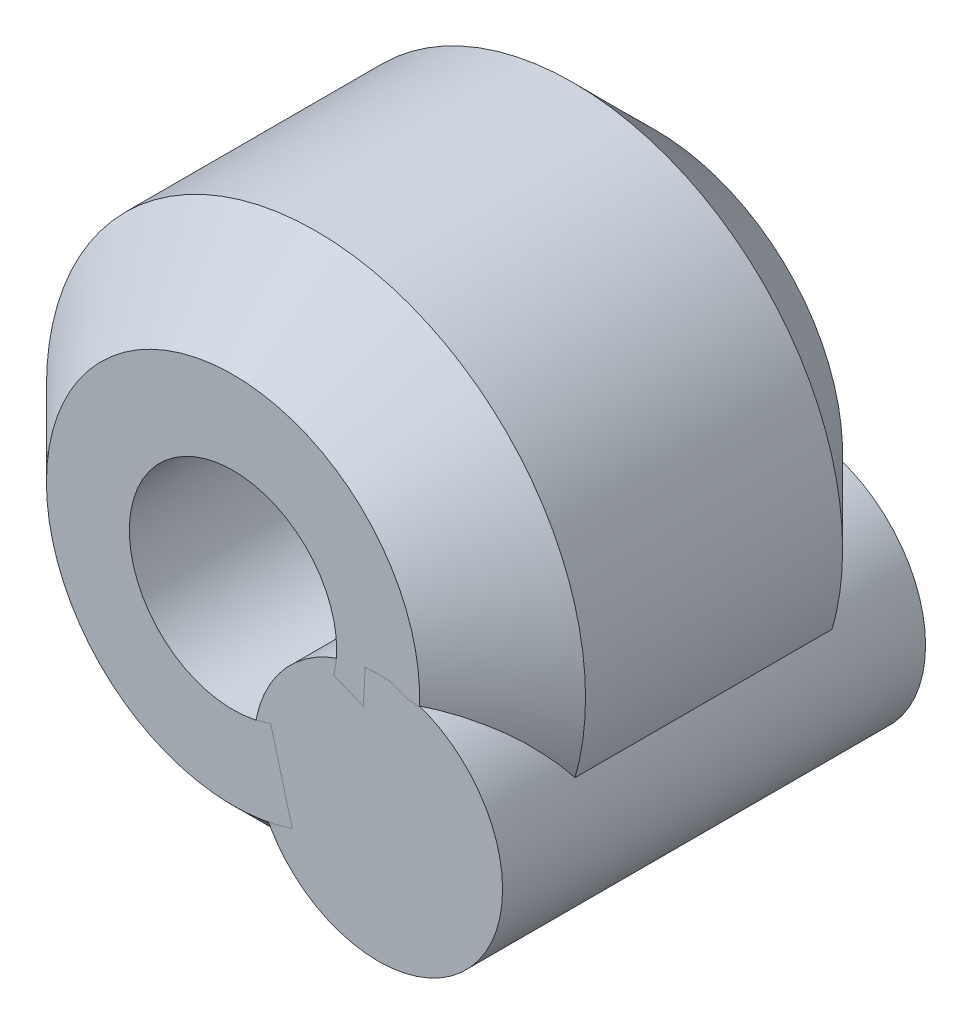
ISO-10303-21;
HEADER;
FILE_DESCRIPTION(('STEP AP214'),'2;1');
FILE_NAME('part.step','',(''),(''),'','','');
FILE_SCHEMA(('AUTOMOTIVE_DESIGN { 1 0 10303 214 1 1 1 1 }'));
ENDSEC;
DATA;
#1=APPLICATION_CONTEXT('core data for automotive mechanical design processes');
#2=APPLICATION_PROTOCOL_DEFINITION('international standard','automotive_design',2000,#1);
#3=PRODUCT_CONTEXT('',#1,'mechanical');
#4=PRODUCT('Part','Part','',(#3));
#5=PRODUCT_RELATED_PRODUCT_CATEGORY('part','',(#4));
#6=PRODUCT_DEFINITION_FORMATION('','',#4);
#7=PRODUCT_DEFINITION_CONTEXT('part definition',#1,'design');
#8=PRODUCT_DEFINITION('design','',#6,#7);
#9=PRODUCT_DEFINITION_SHAPE('','',#8);
#10=(LENGTH_UNIT() NAMED_UNIT(*) SI_UNIT(.MILLI.,.METRE.));
#11=(NAMED_UNIT(*) PLANE_ANGLE_UNIT() SI_UNIT($,.RADIAN.));
#12=(NAMED_UNIT(*) SI_UNIT($,.STERADIAN.) SOLID_ANGLE_UNIT());
#13=UNCERTAINTY_MEASURE_WITH_UNIT(LENGTH_MEASURE(1.E-05),#10,'distance_accuracy_value','');
#14=(GEOMETRIC_REPRESENTATION_CONTEXT(3) GLOBAL_UNCERTAINTY_ASSIGNED_CONTEXT((#13)) GLOBAL_UNIT_ASSIGNED_CONTEXT((#10,
#11,#12)) REPRESENTATION_CONTEXT('',''));
#15=CARTESIAN_POINT('',(0.,0.,0.));
#16=DIRECTION('',(0.,0.,1.));
#17=DIRECTION('',(1.,0.,0.));
#18=AXIS2_PLACEMENT_3D('',#15,#16,#17);
#19=CARTESIAN_POINT('',(-14.5,0.,-5.1));
#20=DIRECTION('',(0.,0.,-1.));
#21=DIRECTION('',(-1.,0.,0.));
#22=AXIS2_PLACEMENT_3D('',#19,#20,#21);
#23=CYLINDRICAL_SURFACE('',#22,6.5);
#24=CARTESIAN_POINT('',(-14.5,0.,-3.1));
#25=DIRECTION('',(0.,0.,-1.));
#26=DIRECTION('',(-1.,0.,0.));
#27=AXIS2_PLACEMENT_3D('',#24,#25,#26);
#28=CIRCLE('',#27,6.5);
#29=CARTESIAN_POINT('',(-21.,0.,-3.1));
#30=VERTEX_POINT('',#29);
#31=EDGE_CURVE('E11',#30,#30,#28,.T.);
#32=ORIENTED_EDGE('',*,*,#31,.F.);
#33=EDGE_LOOP('',(#32));
#34=FACE_BOUND('',#33,.T.);
#35=CARTESIAN_POINT('',(-14.5,0.,3.1));
#36=DIRECTION('',(0.,0.,-1.));
#37=DIRECTION('',(-1.,0.,0.));
#38=AXIS2_PLACEMENT_3D('',#35,#36,#37);
#39=CIRCLE('',#38,6.5);
#40=CARTESIAN_POINT('',(-21.,0.,3.1));
#41=VERTEX_POINT('',#40);
#42=EDGE_CURVE('E58',#41,#41,#39,.T.);
#43=ORIENTED_EDGE('',*,*,#42,.T.);
#44=EDGE_LOOP('',(#43));
#45=FACE_BOUND('',#44,.T.);
#46=ADVANCED_FACE('F44',(#34,#45),#23,.T.);
#47=CARTESIAN_POINT('',(-14.5,0.,-3.1));
#48=DIRECTION('',(0.,0.,1.));
#49=DIRECTION('',(1.,0.,0.));
#50=AXIS2_PLACEMENT_3D('',#47,#48,#49);
#51=CONICAL_SURFACE('',#50,6.5,0.785398163397447);
#52=CARTESIAN_POINT('',(-14.5,0.,-5.1));
#53=DIRECTION('',(0.,0.,-1.));
#54=DIRECTION('',(-1.,0.,0.));
#55=AXIS2_PLACEMENT_3D('',#52,#53,#54);
#56=CIRCLE('',#55,4.5);
#57=CARTESIAN_POINT('',(-19.,0.,-5.1));
#58=VERTEX_POINT('',#57);
#59=EDGE_CURVE('E50',#58,#58,#56,.T.);
#60=ORIENTED_EDGE('',*,*,#59,.F.);
#61=EDGE_LOOP('',(#60));
#62=FACE_BOUND('',#61,.T.);
#63=ORIENTED_EDGE('',*,*,#31,.T.);
#64=EDGE_LOOP('',(#63));
#65=FACE_BOUND('',#64,.T.);
#66=ADVANCED_FACE('F90',(#62,#65),#51,.T.);
#67=CARTESIAN_POINT('',(-10.,0.,-5.1));
#68=DIRECTION('',(0.,0.,1.));
#69=DIRECTION('',(1.,0.,0.));
#70=AXIS2_PLACEMENT_3D('',#67,#68,#69);
#71=PLANE('',#70);
#72=CARTESIAN_POINT('',(-14.5,0.,-5.1));
#73=DIRECTION('',(0.,0.,1.));
#74=DIRECTION('',(1.,0.,0.));
#75=AXIS2_PLACEMENT_3D('',#72,#73,#74);
#76=CIRCLE('',#75,2.5);
#77=CARTESIAN_POINT('',(-12.,0.,-5.1));
#78=VERTEX_POINT('',#77);
#79=EDGE_CURVE('E63',#78,#78,#76,.T.);
#80=ORIENTED_EDGE('',*,*,#79,.T.);
#81=EDGE_LOOP('',(#80));
#82=FACE_BOUND('',#81,.T.);
#83=ORIENTED_EDGE('',*,*,#59,.T.);
#84=EDGE_LOOP('',(#83));
#85=FACE_BOUND('',#84,.T.);
#86=ADVANCED_FACE('F76',(#82,#85),#71,.F.);
#87=CARTESIAN_POINT('',(-14.5,0.,5.10000000000001));
#88=DIRECTION('',(0.,0.,-1.));
#89=DIRECTION('',(-1.,0.,0.));
#90=AXIS2_PLACEMENT_3D('',#87,#88,#89);
#91=PLANE('',#90);
#92=CARTESIAN_POINT('',(-14.5,0.,5.10000000000001));
#93=DIRECTION('',(0.,0.,1.));
#94=DIRECTION('',(1.,0.,0.));
#95=AXIS2_PLACEMENT_3D('',#92,#93,#94);
#96=CIRCLE('',#95,2.5);
#97=CARTESIAN_POINT('',(-12.,0.,5.10000000000001));
#98=VERTEX_POINT('',#97);
#99=EDGE_CURVE('E66',#98,#98,#96,.T.);
#100=ORIENTED_EDGE('',*,*,#99,.F.);
#101=EDGE_LOOP('',(#100));
#102=FACE_BOUND('',#101,.T.);
#103=CARTESIAN_POINT('',(-14.5,0.,5.10000000000001));
#104=DIRECTION('',(0.,0.,-1.));
#105=DIRECTION('',(-1.,0.,0.));
#106=AXIS2_PLACEMENT_3D('',#103,#104,#105);
#107=CIRCLE('',#106,4.5);
#108=CARTESIAN_POINT('',(-19.,0.,5.10000000000001));
#109=VERTEX_POINT('',#108);
#110=EDGE_CURVE('E54',#109,#109,#107,.T.);
#111=ORIENTED_EDGE('',*,*,#110,.F.);
#112=EDGE_LOOP('',(#111));
#113=FACE_BOUND('',#112,.T.);
#114=ADVANCED_FACE('F72',(#102,#113),#91,.F.);
#115=CARTESIAN_POINT('',(-14.5,0.,5.10000000000001));
#116=DIRECTION('',(0.,0.,-1.));
#117=DIRECTION('',(-1.,0.,0.));
#118=AXIS2_PLACEMENT_3D('',#115,#116,#117);
#119=CONICAL_SURFACE('',#118,4.5,0.785398163397448);
#120=ORIENTED_EDGE('',*,*,#42,.F.);
#121=EDGE_LOOP('',(#120));
#122=FACE_BOUND('',#121,.T.);
#123=ORIENTED_EDGE('',*,*,#110,.T.);
#124=EDGE_LOOP('',(#123));
#125=FACE_BOUND('',#124,.T.);
#126=ADVANCED_FACE('F75',(#122,#125),#119,.T.);
#127=CARTESIAN_POINT('',(-14.5,0.,-5.1));
#128=DIRECTION('',(0.,0.,1.));
#129=DIRECTION('',(1.,0.,0.));
#130=AXIS2_PLACEMENT_3D('',#127,#128,#129);
#131=CYLINDRICAL_SURFACE('',#130,2.5);
#132=ORIENTED_EDGE('',*,*,#79,.F.);
#133=EDGE_LOOP('',(#132));
#134=FACE_BOUND('',#133,.T.);
#135=ORIENTED_EDGE('',*,*,#99,.T.);
#136=EDGE_LOOP('',(#135));
#137=FACE_BOUND('',#136,.T.);
#138=ADVANCED_FACE('F70',(#134,#137),#131,.F.);
#139=CLOSED_SHELL('',(#46,#66,#86,#114,#126,#138));
#140=MANIFOLD_SOLID_BREP('B2',#139);
#141=CARTESIAN_POINT('',(-11.,-3.,5.10000000000001));
#142=DIRECTION('',(0.,0.,-1.));
#143=DIRECTION('',(-1.,0.,0.));
#144=AXIS2_PLACEMENT_3D('',#141,#142,#143);
#145=CYLINDRICAL_SURFACE('',#144,3.);
#146=CARTESIAN_POINT('',(-11.,-3.,5.10000000000001));
#147=DIRECTION('',(0.,0.,1.));
#148=DIRECTION('',(1.,0.,0.));
#149=AXIS2_PLACEMENT_3D('',#146,#147,#148);
#150=CIRCLE('',#149,3.);
#151=CARTESIAN_POINT('',(-7.99999999999999,-3.,5.10000000000001));
#152=VERTEX_POINT('',#151);
#153=EDGE_CURVE('E43',#152,#152,#150,.T.);
#154=ORIENTED_EDGE('',*,*,#153,.F.);
#155=EDGE_LOOP('',(#154));
#156=FACE_BOUND('',#155,.T.);
#157=CARTESIAN_POINT('',(-11.,-3.,-5.1));
#158=DIRECTION('',(0.,0.,1.));
#159=DIRECTION('',(1.,0.,0.));
#160=AXIS2_PLACEMENT_3D('',#157,#158,#159);
#161=CIRCLE('',#160,3.);
#162=CARTESIAN_POINT('',(-7.99999999999999,-3.,-5.1));
#163=VERTEX_POINT('',#162);
#164=EDGE_CURVE('E157',#163,#163,#161,.T.);
#165=ORIENTED_EDGE('',*,*,#164,.T.);
#166=EDGE_LOOP('',(#165));
#167=FACE_BOUND('',#166,.T.);
#168=ADVANCED_FACE('F151',(#156,#167),#145,.T.);
#169=CARTESIAN_POINT('',(-11.,-3.,5.10000000000001));
#170=DIRECTION('',(0.,0.,1.));
#171=DIRECTION('',(1.,0.,0.));
#172=AXIS2_PLACEMENT_3D('',#169,#170,#171);
#173=PLANE('',#172);
#174=ORIENTED_EDGE('',*,*,#153,.T.);
#175=EDGE_LOOP('',(#174));
#176=FACE_BOUND('',#175,.T.);
#177=ADVANCED_FACE('F166',(#176),#173,.T.);
#178=CARTESIAN_POINT('',(-11.,-3.,-5.1));
#179=DIRECTION('',(0.,0.,1.));
#180=DIRECTION('',(1.,0.,0.));
#181=AXIS2_PLACEMENT_3D('',#178,#179,#180);
#182=PLANE('',#181);
#183=ORIENTED_EDGE('',*,*,#164,.F.);
#184=EDGE_LOOP('',(#183));
#185=FACE_BOUND('',#184,.T.);
#186=ADVANCED_FACE('F164',(#185),#182,.F.);
#187=CLOSED_SHELL('',(#168,#177,#186));
#188=MANIFOLD_SOLID_BREP('B6_NOT_SHOWN',#187);
#189=ADVANCED_BREP_SHAPE_REPRESENTATION('',(#18,#140,#188),#14);
#190=SHAPE_DEFINITION_REPRESENTATION(#9,#189);
ENDSEC;
END-ISO-10303-21;
